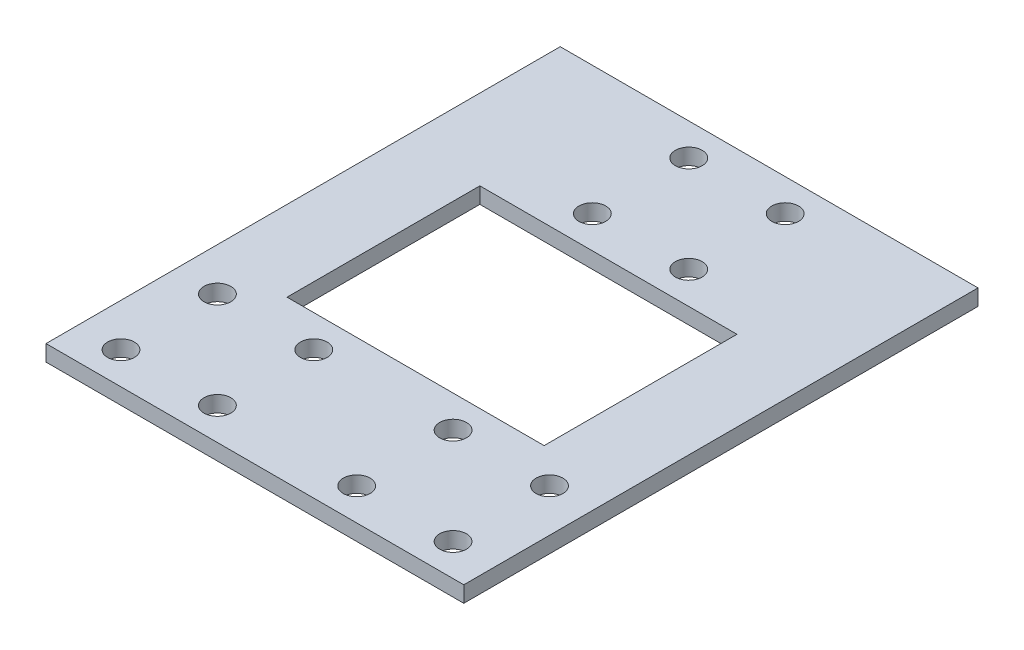
ISO-10303-21;
HEADER;
FILE_DESCRIPTION(('STEP AP214'),'2;1');
FILE_NAME('part.step','',(''),(''),'','','');
FILE_SCHEMA(('AUTOMOTIVE_DESIGN { 1 0 10303 214 1 1 1 1 }'));
ENDSEC;
DATA;
#1=APPLICATION_CONTEXT('core data for automotive mechanical design processes');
#2=APPLICATION_PROTOCOL_DEFINITION('international standard','automotive_design',2000,#1);
#3=PRODUCT_CONTEXT('',#1,'mechanical');
#4=PRODUCT('Part','Part','',(#3));
#5=PRODUCT_RELATED_PRODUCT_CATEGORY('part','',(#4));
#6=PRODUCT_DEFINITION_FORMATION('','',#4);
#7=PRODUCT_DEFINITION_CONTEXT('part definition',#1,'design');
#8=PRODUCT_DEFINITION('design','',#6,#7);
#9=PRODUCT_DEFINITION_SHAPE('','',#8);
#10=(LENGTH_UNIT() NAMED_UNIT(*) SI_UNIT(.MILLI.,.METRE.));
#11=(NAMED_UNIT(*) PLANE_ANGLE_UNIT() SI_UNIT($,.RADIAN.));
#12=(NAMED_UNIT(*) SI_UNIT($,.STERADIAN.) SOLID_ANGLE_UNIT());
#13=UNCERTAINTY_MEASURE_WITH_UNIT(LENGTH_MEASURE(1.E-05),#10,'distance_accuracy_value','');
#14=(GEOMETRIC_REPRESENTATION_CONTEXT(3) GLOBAL_UNCERTAINTY_ASSIGNED_CONTEXT((#13)) GLOBAL_UNIT_ASSIGNED_CONTEXT((#10,
#11,#12)) REPRESENTATION_CONTEXT('',''));
#15=CARTESIAN_POINT('',(0.,0.,0.));
#16=DIRECTION('',(0.,0.,1.));
#17=DIRECTION('',(1.,0.,0.));
#18=AXIS2_PLACEMENT_3D('',#15,#16,#17);
#19=CARTESIAN_POINT('',(0.,3.,0.));
#20=DIRECTION('',(1.,0.,0.));
#21=DIRECTION('',(0.,0.,-1.));
#22=AXIS2_PLACEMENT_3D('',#19,#20,#21);
#23=PLANE('',#22);
#24=DIRECTION('',(0.,0.,1.));
#25=VECTOR('',#24,1.);
#26=CARTESIAN_POINT('',(0.,0.,0.));
#27=LINE('',#26,#25);
#28=CARTESIAN_POINT('',(0.,0.,-96.));
#29=VERTEX_POINT('',#28);
#30=CARTESIAN_POINT('',(0.,0.,0.));
#31=VERTEX_POINT('',#30);
#32=EDGE_CURVE('E203',#29,#31,#27,.T.);
#33=ORIENTED_EDGE('',*,*,#32,.T.);
#34=DIRECTION('',(0.,-1.,0.));
#35=VECTOR('',#34,1.);
#36=CARTESIAN_POINT('',(0.,3.,0.));
#37=LINE('',#36,#35);
#38=CARTESIAN_POINT('',(0.,3.,0.));
#39=VERTEX_POINT('',#38);
#40=EDGE_CURVE('E11',#39,#31,#37,.T.);
#41=ORIENTED_EDGE('',*,*,#40,.F.);
#42=DIRECTION('',(0.,0.,1.));
#43=VECTOR('',#42,1.);
#44=CARTESIAN_POINT('',(0.,3.,0.));
#45=LINE('',#44,#43);
#46=CARTESIAN_POINT('',(0.,3.,-96.));
#47=VERTEX_POINT('',#46);
#48=EDGE_CURVE('E206',#47,#39,#45,.T.);
#49=ORIENTED_EDGE('',*,*,#48,.F.);
#50=DIRECTION('',(0.,-1.,0.));
#51=VECTOR('',#50,1.);
#52=CARTESIAN_POINT('',(0.,3.,-96.));
#53=LINE('',#52,#51);
#54=EDGE_CURVE('E216',#47,#29,#53,.T.);
#55=ORIENTED_EDGE('',*,*,#54,.T.);
#56=EDGE_LOOP('',(#33,#41,#49,#55));
#57=FACE_BOUND('',#56,.T.);
#58=ADVANCED_FACE('F33',(#57),#23,.F.);
#59=CARTESIAN_POINT('',(0.,3.,0.));
#60=DIRECTION('',(0.,0.,-1.));
#61=DIRECTION('',(-1.,0.,0.));
#62=AXIS2_PLACEMENT_3D('',#59,#60,#61);
#63=PLANE('',#62);
#64=DIRECTION('',(1.,0.,0.));
#65=VECTOR('',#64,1.);
#66=CARTESIAN_POINT('',(0.,0.,0.));
#67=LINE('',#66,#65);
#68=CARTESIAN_POINT('',(78.,0.,0.));
#69=VERTEX_POINT('',#68);
#70=EDGE_CURVE('E219',#31,#69,#67,.T.);
#71=ORIENTED_EDGE('',*,*,#70,.T.);
#72=DIRECTION('',(0.,-1.,0.));
#73=VECTOR('',#72,1.);
#74=CARTESIAN_POINT('',(78.,3.,0.));
#75=LINE('',#74,#73);
#76=CARTESIAN_POINT('',(78.,3.,0.));
#77=VERTEX_POINT('',#76);
#78=EDGE_CURVE('E40',#77,#69,#75,.T.);
#79=ORIENTED_EDGE('',*,*,#78,.F.);
#80=DIRECTION('',(1.,0.,0.));
#81=VECTOR('',#80,1.);
#82=CARTESIAN_POINT('',(0.,3.,0.));
#83=LINE('',#82,#81);
#84=EDGE_CURVE('E209',#39,#77,#83,.T.);
#85=ORIENTED_EDGE('',*,*,#84,.F.);
#86=ORIENTED_EDGE('',*,*,#40,.T.);
#87=EDGE_LOOP('',(#71,#79,#85,#86));
#88=FACE_BOUND('',#87,.T.);
#89=ADVANCED_FACE('F248',(#88),#63,.F.);
#90=CARTESIAN_POINT('',(78.,3.,0.));
#91=DIRECTION('',(-1.,0.,0.));
#92=DIRECTION('',(0.,0.,1.));
#93=AXIS2_PLACEMENT_3D('',#90,#91,#92);
#94=PLANE('',#93);
#95=DIRECTION('',(0.,0.,-1.));
#96=VECTOR('',#95,1.);
#97=CARTESIAN_POINT('',(78.,0.,0.));
#98=LINE('',#97,#96);
#99=CARTESIAN_POINT('',(78.,0.,-96.));
#100=VERTEX_POINT('',#99);
#101=EDGE_CURVE('E221',#69,#100,#98,.T.);
#102=ORIENTED_EDGE('',*,*,#101,.T.);
#103=DIRECTION('',(0.,-1.,0.));
#104=VECTOR('',#103,1.);
#105=CARTESIAN_POINT('',(78.,3.,-96.));
#106=LINE('',#105,#104);
#107=CARTESIAN_POINT('',(78.,3.,-96.));
#108=VERTEX_POINT('',#107);
#109=EDGE_CURVE('E226',#108,#100,#106,.T.);
#110=ORIENTED_EDGE('',*,*,#109,.F.);
#111=DIRECTION('',(0.,0.,-1.));
#112=VECTOR('',#111,1.);
#113=CARTESIAN_POINT('',(78.,3.,0.));
#114=LINE('',#113,#112);
#115=EDGE_CURVE('E212',#77,#108,#114,.T.);
#116=ORIENTED_EDGE('',*,*,#115,.F.);
#117=ORIENTED_EDGE('',*,*,#78,.T.);
#118=EDGE_LOOP('',(#102,#110,#116,#117));
#119=FACE_BOUND('',#118,.T.);
#120=ADVANCED_FACE('F233',(#119),#94,.F.);
#121=CARTESIAN_POINT('',(0.,3.,-96.));
#122=DIRECTION('',(0.,0.,1.));
#123=DIRECTION('',(1.,0.,0.));
#124=AXIS2_PLACEMENT_3D('',#121,#122,#123);
#125=PLANE('',#124);
#126=DIRECTION('',(-1.,0.,0.));
#127=VECTOR('',#126,1.);
#128=CARTESIAN_POINT('',(0.,0.,-96.));
#129=LINE('',#128,#127);
#130=EDGE_CURVE('E210',#100,#29,#129,.T.);
#131=ORIENTED_EDGE('',*,*,#130,.T.);
#132=ORIENTED_EDGE('',*,*,#54,.F.);
#133=DIRECTION('',(-1.,0.,0.));
#134=VECTOR('',#133,1.);
#135=CARTESIAN_POINT('',(0.,3.,-96.));
#136=LINE('',#135,#134);
#137=EDGE_CURVE('E214',#108,#47,#136,.T.);
#138=ORIENTED_EDGE('',*,*,#137,.F.);
#139=ORIENTED_EDGE('',*,*,#109,.T.);
#140=EDGE_LOOP('',(#131,#132,#138,#139));
#141=FACE_BOUND('',#140,.T.);
#142=ADVANCED_FACE('F241',(#141),#125,.F.);
#143=CARTESIAN_POINT('',(0.,3.,0.));
#144=DIRECTION('',(0.,-1.,0.));
#145=DIRECTION('',(0.,0.,-1.));
#146=AXIS2_PLACEMENT_3D('',#143,#144,#145);
#147=PLANE('',#146);
#148=DIRECTION('',(1.,0.,0.));
#149=VECTOR('',#148,1.);
#150=CARTESIAN_POINT('',(15.,3.,-30.));
#151=LINE('',#150,#149);
#152=CARTESIAN_POINT('',(15.,3.,-30.));
#153=VERTEX_POINT('',#152);
#154=CARTESIAN_POINT('',(63.,3.,-30.));
#155=VERTEX_POINT('',#154);
#156=EDGE_CURVE('E124',#153,#155,#151,.T.);
#157=ORIENTED_EDGE('',*,*,#156,.F.);
#158=DIRECTION('',(0.,0.,1.));
#159=VECTOR('',#158,1.);
#160=CARTESIAN_POINT('',(15.,3.,-66.0004589335234));
#161=LINE('',#160,#159);
#162=CARTESIAN_POINT('',(15.,3.,-66.0004589335234));
#163=VERTEX_POINT('',#162);
#164=EDGE_CURVE('E47',#163,#153,#161,.T.);
#165=ORIENTED_EDGE('',*,*,#164,.F.);
#166=DIRECTION('',(-1.,0.,0.));
#167=VECTOR('',#166,1.);
#168=CARTESIAN_POINT('',(15.,3.,-66.0004589335234));
#169=LINE('',#168,#167);
#170=CARTESIAN_POINT('',(63.,3.,-66.0004589335234));
#171=VERTEX_POINT('',#170);
#172=EDGE_CURVE('E115',#171,#163,#169,.T.);
#173=ORIENTED_EDGE('',*,*,#172,.F.);
#174=DIRECTION('',(0.,0.,-1.));
#175=VECTOR('',#174,1.);
#176=CARTESIAN_POINT('',(63.,3.,-66.0004589335234));
#177=LINE('',#176,#175);
#178=EDGE_CURVE('E118',#155,#171,#177,.T.);
#179=ORIENTED_EDGE('',*,*,#178,.F.);
#180=EDGE_LOOP('',(#157,#165,#173,#179));
#181=FACE_BOUND('',#180,.T.);
#182=CARTESIAN_POINT('',(30.0000000058494,3.,-90.000458888772));
#183=DIRECTION('',(0.,1.,0.));
#184=DIRECTION('',(0.,0.,1.));
#185=AXIS2_PLACEMENT_3D('',#182,#183,#184);
#186=CIRCLE('',#185,2.5);
#187=CARTESIAN_POINT('',(30.0000000058494,3.,-87.500458888772));
#188=VERTEX_POINT('',#187);
#189=EDGE_CURVE('E130',#188,#188,#186,.T.);
#190=ORIENTED_EDGE('',*,*,#189,.F.);
#191=EDGE_LOOP('',(#190));
#192=FACE_BOUND('',#191,.T.);
#193=CARTESIAN_POINT('',(48.,3.,-90.));
#194=DIRECTION('',(0.,1.,0.));
#195=DIRECTION('',(0.,0.,1.));
#196=AXIS2_PLACEMENT_3D('',#193,#194,#195);
#197=CIRCLE('',#196,2.5);
#198=CARTESIAN_POINT('',(48.,3.,-87.5));
#199=VERTEX_POINT('',#198);
#200=EDGE_CURVE('E137',#199,#199,#197,.T.);
#201=ORIENTED_EDGE('',*,*,#200,.F.);
#202=EDGE_LOOP('',(#201));
#203=FACE_BOUND('',#202,.T.);
#204=CARTESIAN_POINT('',(30.0012692785284,3.,-72.0004589335234));
#205=DIRECTION('',(0.,1.,0.));
#206=DIRECTION('',(0.,0.,1.));
#207=AXIS2_PLACEMENT_3D('',#204,#205,#206);
#208=CIRCLE('',#207,2.49999999999995);
#209=CARTESIAN_POINT('',(30.0012692785284,3.,-69.5004589335235));
#210=VERTEX_POINT('',#209);
#211=EDGE_CURVE('E143',#210,#210,#208,.T.);
#212=ORIENTED_EDGE('',*,*,#211,.F.);
#213=EDGE_LOOP('',(#212));
#214=FACE_BOUND('',#213,.T.);
#215=CARTESIAN_POINT('',(48.001269272679,3.,-72.0000000447515));
#216=DIRECTION('',(0.,1.,0.));
#217=DIRECTION('',(0.,0.,1.));
#218=AXIS2_PLACEMENT_3D('',#215,#216,#217);
#219=CIRCLE('',#218,2.5);
#220=CARTESIAN_POINT('',(48.001269272679,3.,-69.5000000447515));
#221=VERTEX_POINT('',#220);
#222=EDGE_CURVE('E149',#221,#221,#219,.T.);
#223=ORIENTED_EDGE('',*,*,#222,.F.);
#224=EDGE_LOOP('',(#223));
#225=FACE_BOUND('',#224,.T.);
#226=CARTESIAN_POINT('',(52.,3.,-24.));
#227=DIRECTION('',(0.,1.,0.));
#228=DIRECTION('',(0.,0.,1.));
#229=AXIS2_PLACEMENT_3D('',#226,#227,#228);
#230=CIRCLE('',#229,2.50000000000001);
#231=CARTESIAN_POINT('',(52.,3.,-21.5));
#232=VERTEX_POINT('',#231);
#233=EDGE_CURVE('E155',#232,#232,#230,.T.);
#234=ORIENTED_EDGE('',*,*,#233,.F.);
#235=EDGE_LOOP('',(#234));
#236=FACE_BOUND('',#235,.T.);
#237=CARTESIAN_POINT('',(70.,3.,-24.));
#238=DIRECTION('',(0.,1.,0.));
#239=DIRECTION('',(0.,0.,1.));
#240=AXIS2_PLACEMENT_3D('',#237,#238,#239);
#241=CIRCLE('',#240,2.5);
#242=CARTESIAN_POINT('',(70.,3.,-21.5));
#243=VERTEX_POINT('',#242);
#244=EDGE_CURVE('E161',#243,#243,#241,.T.);
#245=ORIENTED_EDGE('',*,*,#244,.F.);
#246=EDGE_LOOP('',(#245));
#247=FACE_BOUND('',#246,.T.);
#248=CARTESIAN_POINT('',(70.,3.,-6.00000000000001));
#249=DIRECTION('',(0.,1.,0.));
#250=DIRECTION('',(0.,0.,1.));
#251=AXIS2_PLACEMENT_3D('',#248,#249,#250);
#252=CIRCLE('',#251,2.49999999999999);
#253=CARTESIAN_POINT('',(70.,3.,-3.50000000000001));
#254=VERTEX_POINT('',#253);
#255=EDGE_CURVE('E167',#254,#254,#252,.T.);
#256=ORIENTED_EDGE('',*,*,#255,.F.);
#257=EDGE_LOOP('',(#256));
#258=FACE_BOUND('',#257,.T.);
#259=CARTESIAN_POINT('',(52.,3.,-6.00000000000001));
#260=DIRECTION('',(0.,1.,0.));
#261=DIRECTION('',(0.,0.,1.));
#262=AXIS2_PLACEMENT_3D('',#259,#260,#261);
#263=CIRCLE('',#262,2.49999999999999);
#264=CARTESIAN_POINT('',(52.,3.,-3.50000000000001));
#265=VERTEX_POINT('',#264);
#266=EDGE_CURVE('E173',#265,#265,#263,.T.);
#267=ORIENTED_EDGE('',*,*,#266,.F.);
#268=EDGE_LOOP('',(#267));
#269=FACE_BOUND('',#268,.T.);
#270=CARTESIAN_POINT('',(26.,3.,-24.));
#271=DIRECTION('',(0.,1.,0.));
#272=DIRECTION('',(0.,0.,1.));
#273=AXIS2_PLACEMENT_3D('',#270,#271,#272);
#274=CIRCLE('',#273,2.5);
#275=CARTESIAN_POINT('',(26.,3.,-21.5));
#276=VERTEX_POINT('',#275);
#277=EDGE_CURVE('E179',#276,#276,#274,.T.);
#278=ORIENTED_EDGE('',*,*,#277,.F.);
#279=EDGE_LOOP('',(#278));
#280=FACE_BOUND('',#279,.T.);
#281=CARTESIAN_POINT('',(8.,3.,-24.));
#282=DIRECTION('',(0.,1.,0.));
#283=DIRECTION('',(0.,0.,1.));
#284=AXIS2_PLACEMENT_3D('',#281,#282,#283);
#285=CIRCLE('',#284,2.5);
#286=CARTESIAN_POINT('',(8.,3.,-21.5));
#287=VERTEX_POINT('',#286);
#288=EDGE_CURVE('E185',#287,#287,#285,.T.);
#289=ORIENTED_EDGE('',*,*,#288,.F.);
#290=EDGE_LOOP('',(#289));
#291=FACE_BOUND('',#290,.T.);
#292=CARTESIAN_POINT('',(26.,3.,-6.00000000000001));
#293=DIRECTION('',(0.,1.,0.));
#294=DIRECTION('',(0.,0.,1.));
#295=AXIS2_PLACEMENT_3D('',#292,#293,#294);
#296=CIRCLE('',#295,2.5);
#297=CARTESIAN_POINT('',(26.,3.,-3.50000000000001));
#298=VERTEX_POINT('',#297);
#299=EDGE_CURVE('E191',#298,#298,#296,.T.);
#300=ORIENTED_EDGE('',*,*,#299,.F.);
#301=EDGE_LOOP('',(#300));
#302=FACE_BOUND('',#301,.T.);
#303=CARTESIAN_POINT('',(8.,3.,-6.00000000000001));
#304=DIRECTION('',(0.,1.,0.));
#305=DIRECTION('',(0.,0.,1.));
#306=AXIS2_PLACEMENT_3D('',#303,#304,#305);
#307=CIRCLE('',#306,2.5);
#308=CARTESIAN_POINT('',(8.,3.,-3.5));
#309=VERTEX_POINT('',#308);
#310=EDGE_CURVE('E197',#309,#309,#307,.T.);
#311=ORIENTED_EDGE('',*,*,#310,.F.);
#312=EDGE_LOOP('',(#311));
#313=FACE_BOUND('',#312,.T.);
#314=ORIENTED_EDGE('',*,*,#48,.T.);
#315=ORIENTED_EDGE('',*,*,#84,.T.);
#316=ORIENTED_EDGE('',*,*,#115,.T.);
#317=ORIENTED_EDGE('',*,*,#137,.T.);
#318=EDGE_LOOP('',(#314,#315,#316,#317));
#319=FACE_BOUND('',#318,.T.);
#320=ADVANCED_FACE('F247',(#181,#192,#203,#214,#225,#236,#247,#258,#269,#280,#291,#302,#313,
#319),#147,.F.);
#321=CARTESIAN_POINT('',(0.,0.,0.));
#322=DIRECTION('',(0.,-1.,0.));
#323=DIRECTION('',(0.,0.,-1.));
#324=AXIS2_PLACEMENT_3D('',#321,#322,#323);
#325=PLANE('',#324);
#326=DIRECTION('',(0.,0.,1.));
#327=VECTOR('',#326,1.);
#328=CARTESIAN_POINT('',(15.,0.,-66.0004589335234));
#329=LINE('',#328,#327);
#330=CARTESIAN_POINT('',(15.,0.,-66.0004589335234));
#331=VERTEX_POINT('',#330);
#332=CARTESIAN_POINT('',(15.,0.,-30.));
#333=VERTEX_POINT('',#332);
#334=EDGE_CURVE('E99',#331,#333,#329,.T.);
#335=ORIENTED_EDGE('',*,*,#334,.T.);
#336=DIRECTION('',(1.,0.,0.));
#337=VECTOR('',#336,1.);
#338=CARTESIAN_POINT('',(15.,0.,-30.));
#339=LINE('',#338,#337);
#340=CARTESIAN_POINT('',(63.,0.,-30.));
#341=VERTEX_POINT('',#340);
#342=EDGE_CURVE('E108',#333,#341,#339,.T.);
#343=ORIENTED_EDGE('',*,*,#342,.T.);
#344=DIRECTION('',(0.,0.,-1.));
#345=VECTOR('',#344,1.);
#346=CARTESIAN_POINT('',(63.,0.,-66.0004589335234));
#347=LINE('',#346,#345);
#348=CARTESIAN_POINT('',(63.,0.,-66.0004589335234));
#349=VERTEX_POINT('',#348);
#350=EDGE_CURVE('E55',#341,#349,#347,.T.);
#351=ORIENTED_EDGE('',*,*,#350,.T.);
#352=DIRECTION('',(-1.,0.,0.));
#353=VECTOR('',#352,1.);
#354=CARTESIAN_POINT('',(15.,0.,-66.0004589335234));
#355=LINE('',#354,#353);
#356=EDGE_CURVE('E105',#349,#331,#355,.T.);
#357=ORIENTED_EDGE('',*,*,#356,.T.);
#358=EDGE_LOOP('',(#335,#343,#351,#357));
#359=FACE_BOUND('',#358,.T.);
#360=CARTESIAN_POINT('',(30.0000000058494,0.,-90.000458888772));
#361=DIRECTION('',(0.,1.,0.));
#362=DIRECTION('',(0.,0.,1.));
#363=AXIS2_PLACEMENT_3D('',#360,#361,#362);
#364=CIRCLE('',#363,2.5);
#365=CARTESIAN_POINT('',(30.0000000058494,0.,-87.500458888772));
#366=VERTEX_POINT('',#365);
#367=EDGE_CURVE('E134',#366,#366,#364,.T.);
#368=ORIENTED_EDGE('',*,*,#367,.T.);
#369=EDGE_LOOP('',(#368));
#370=FACE_BOUND('',#369,.T.);
#371=CARTESIAN_POINT('',(48.,0.,-90.));
#372=DIRECTION('',(0.,1.,0.));
#373=DIRECTION('',(0.,0.,1.));
#374=AXIS2_PLACEMENT_3D('',#371,#372,#373);
#375=CIRCLE('',#374,2.5);
#376=CARTESIAN_POINT('',(48.,0.,-87.5));
#377=VERTEX_POINT('',#376);
#378=EDGE_CURVE('E140',#377,#377,#375,.T.);
#379=ORIENTED_EDGE('',*,*,#378,.T.);
#380=EDGE_LOOP('',(#379));
#381=FACE_BOUND('',#380,.T.);
#382=CARTESIAN_POINT('',(30.0012692785284,0.,-72.0004589335234));
#383=DIRECTION('',(0.,1.,0.));
#384=DIRECTION('',(0.,0.,1.));
#385=AXIS2_PLACEMENT_3D('',#382,#383,#384);
#386=CIRCLE('',#385,2.49999999999995);
#387=CARTESIAN_POINT('',(30.0012692785284,0.,-69.5004589335235));
#388=VERTEX_POINT('',#387);
#389=EDGE_CURVE('E146',#388,#388,#386,.T.);
#390=ORIENTED_EDGE('',*,*,#389,.T.);
#391=EDGE_LOOP('',(#390));
#392=FACE_BOUND('',#391,.T.);
#393=CARTESIAN_POINT('',(48.001269272679,0.,-72.0000000447515));
#394=DIRECTION('',(0.,1.,0.));
#395=DIRECTION('',(0.,0.,1.));
#396=AXIS2_PLACEMENT_3D('',#393,#394,#395);
#397=CIRCLE('',#396,2.5);
#398=CARTESIAN_POINT('',(48.001269272679,0.,-69.5000000447515));
#399=VERTEX_POINT('',#398);
#400=EDGE_CURVE('E152',#399,#399,#397,.T.);
#401=ORIENTED_EDGE('',*,*,#400,.T.);
#402=EDGE_LOOP('',(#401));
#403=FACE_BOUND('',#402,.T.);
#404=CARTESIAN_POINT('',(52.,0.,-24.));
#405=DIRECTION('',(0.,1.,0.));
#406=DIRECTION('',(0.,0.,1.));
#407=AXIS2_PLACEMENT_3D('',#404,#405,#406);
#408=CIRCLE('',#407,2.50000000000001);
#409=CARTESIAN_POINT('',(52.,0.,-21.5));
#410=VERTEX_POINT('',#409);
#411=EDGE_CURVE('E158',#410,#410,#408,.T.);
#412=ORIENTED_EDGE('',*,*,#411,.T.);
#413=EDGE_LOOP('',(#412));
#414=FACE_BOUND('',#413,.T.);
#415=CARTESIAN_POINT('',(70.,0.,-24.));
#416=DIRECTION('',(0.,1.,0.));
#417=DIRECTION('',(0.,0.,1.));
#418=AXIS2_PLACEMENT_3D('',#415,#416,#417);
#419=CIRCLE('',#418,2.5);
#420=CARTESIAN_POINT('',(70.,0.,-21.5));
#421=VERTEX_POINT('',#420);
#422=EDGE_CURVE('E164',#421,#421,#419,.T.);
#423=ORIENTED_EDGE('',*,*,#422,.T.);
#424=EDGE_LOOP('',(#423));
#425=FACE_BOUND('',#424,.T.);
#426=CARTESIAN_POINT('',(70.,0.,-6.00000000000001));
#427=DIRECTION('',(0.,1.,0.));
#428=DIRECTION('',(0.,0.,1.));
#429=AXIS2_PLACEMENT_3D('',#426,#427,#428);
#430=CIRCLE('',#429,2.49999999999999);
#431=CARTESIAN_POINT('',(70.,0.,-3.50000000000001));
#432=VERTEX_POINT('',#431);
#433=EDGE_CURVE('E170',#432,#432,#430,.T.);
#434=ORIENTED_EDGE('',*,*,#433,.T.);
#435=EDGE_LOOP('',(#434));
#436=FACE_BOUND('',#435,.T.);
#437=CARTESIAN_POINT('',(52.,0.,-6.00000000000001));
#438=DIRECTION('',(0.,1.,0.));
#439=DIRECTION('',(0.,0.,1.));
#440=AXIS2_PLACEMENT_3D('',#437,#438,#439);
#441=CIRCLE('',#440,2.49999999999999);
#442=CARTESIAN_POINT('',(52.,0.,-3.50000000000001));
#443=VERTEX_POINT('',#442);
#444=EDGE_CURVE('E176',#443,#443,#441,.T.);
#445=ORIENTED_EDGE('',*,*,#444,.T.);
#446=EDGE_LOOP('',(#445));
#447=FACE_BOUND('',#446,.T.);
#448=CARTESIAN_POINT('',(26.,0.,-24.));
#449=DIRECTION('',(0.,1.,0.));
#450=DIRECTION('',(0.,0.,1.));
#451=AXIS2_PLACEMENT_3D('',#448,#449,#450);
#452=CIRCLE('',#451,2.5);
#453=CARTESIAN_POINT('',(26.,0.,-21.5));
#454=VERTEX_POINT('',#453);
#455=EDGE_CURVE('E182',#454,#454,#452,.T.);
#456=ORIENTED_EDGE('',*,*,#455,.T.);
#457=EDGE_LOOP('',(#456));
#458=FACE_BOUND('',#457,.T.);
#459=CARTESIAN_POINT('',(8.,0.,-24.));
#460=DIRECTION('',(0.,1.,0.));
#461=DIRECTION('',(0.,0.,1.));
#462=AXIS2_PLACEMENT_3D('',#459,#460,#461);
#463=CIRCLE('',#462,2.5);
#464=CARTESIAN_POINT('',(8.,0.,-21.5));
#465=VERTEX_POINT('',#464);
#466=EDGE_CURVE('E188',#465,#465,#463,.T.);
#467=ORIENTED_EDGE('',*,*,#466,.T.);
#468=EDGE_LOOP('',(#467));
#469=FACE_BOUND('',#468,.T.);
#470=CARTESIAN_POINT('',(26.,0.,-6.00000000000001));
#471=DIRECTION('',(0.,1.,0.));
#472=DIRECTION('',(0.,0.,1.));
#473=AXIS2_PLACEMENT_3D('',#470,#471,#472);
#474=CIRCLE('',#473,2.5);
#475=CARTESIAN_POINT('',(26.,0.,-3.50000000000001));
#476=VERTEX_POINT('',#475);
#477=EDGE_CURVE('E194',#476,#476,#474,.T.);
#478=ORIENTED_EDGE('',*,*,#477,.T.);
#479=EDGE_LOOP('',(#478));
#480=FACE_BOUND('',#479,.T.);
#481=CARTESIAN_POINT('',(8.,0.,-6.00000000000001));
#482=DIRECTION('',(0.,1.,0.));
#483=DIRECTION('',(0.,0.,1.));
#484=AXIS2_PLACEMENT_3D('',#481,#482,#483);
#485=CIRCLE('',#484,2.5);
#486=CARTESIAN_POINT('',(8.,0.,-3.5));
#487=VERTEX_POINT('',#486);
#488=EDGE_CURVE('E200',#487,#487,#485,.T.);
#489=ORIENTED_EDGE('',*,*,#488,.T.);
#490=EDGE_LOOP('',(#489));
#491=FACE_BOUND('',#490,.T.);
#492=ORIENTED_EDGE('',*,*,#32,.F.);
#493=ORIENTED_EDGE('',*,*,#130,.F.);
#494=ORIENTED_EDGE('',*,*,#101,.F.);
#495=ORIENTED_EDGE('',*,*,#70,.F.);
#496=EDGE_LOOP('',(#492,#493,#494,#495));
#497=FACE_BOUND('',#496,.T.);
#498=ADVANCED_FACE('F112',(#359,#370,#381,#392,#403,#414,#425,#436,#447,#458,#469,#480,#491,
#497),#325,.T.);
#499=CARTESIAN_POINT('',(8.,0.,-6.00000000000001));
#500=DIRECTION('',(0.,1.,0.));
#501=DIRECTION('',(0.,0.,1.));
#502=AXIS2_PLACEMENT_3D('',#499,#500,#501);
#503=CYLINDRICAL_SURFACE('',#502,2.5);
#504=ORIENTED_EDGE('',*,*,#488,.F.);
#505=EDGE_LOOP('',(#504));
#506=FACE_BOUND('',#505,.T.);
#507=ORIENTED_EDGE('',*,*,#310,.T.);
#508=EDGE_LOOP('',(#507));
#509=FACE_BOUND('',#508,.T.);
#510=ADVANCED_FACE('F260',(#506,#509),#503,.F.);
#511=CARTESIAN_POINT('',(26.,0.,-6.00000000000001));
#512=DIRECTION('',(0.,1.,0.));
#513=DIRECTION('',(0.,0.,1.));
#514=AXIS2_PLACEMENT_3D('',#511,#512,#513);
#515=CYLINDRICAL_SURFACE('',#514,2.5);
#516=ORIENTED_EDGE('',*,*,#477,.F.);
#517=EDGE_LOOP('',(#516));
#518=FACE_BOUND('',#517,.T.);
#519=ORIENTED_EDGE('',*,*,#299,.T.);
#520=EDGE_LOOP('',(#519));
#521=FACE_BOUND('',#520,.T.);
#522=ADVANCED_FACE('F266',(#518,#521),#515,.F.);
#523=CARTESIAN_POINT('',(8.,0.,-24.));
#524=DIRECTION('',(0.,1.,0.));
#525=DIRECTION('',(0.,0.,1.));
#526=AXIS2_PLACEMENT_3D('',#523,#524,#525);
#527=CYLINDRICAL_SURFACE('',#526,2.5);
#528=ORIENTED_EDGE('',*,*,#466,.F.);
#529=EDGE_LOOP('',(#528));
#530=FACE_BOUND('',#529,.T.);
#531=ORIENTED_EDGE('',*,*,#288,.T.);
#532=EDGE_LOOP('',(#531));
#533=FACE_BOUND('',#532,.T.);
#534=ADVANCED_FACE('F270',(#530,#533),#527,.F.);
#535=CARTESIAN_POINT('',(26.,0.,-24.));
#536=DIRECTION('',(0.,1.,0.));
#537=DIRECTION('',(0.,0.,1.));
#538=AXIS2_PLACEMENT_3D('',#535,#536,#537);
#539=CYLINDRICAL_SURFACE('',#538,2.5);
#540=ORIENTED_EDGE('',*,*,#455,.F.);
#541=EDGE_LOOP('',(#540));
#542=FACE_BOUND('',#541,.T.);
#543=ORIENTED_EDGE('',*,*,#277,.T.);
#544=EDGE_LOOP('',(#543));
#545=FACE_BOUND('',#544,.T.);
#546=ADVANCED_FACE('F274',(#542,#545),#539,.F.);
#547=CARTESIAN_POINT('',(52.,0.,-6.00000000000001));
#548=DIRECTION('',(0.,1.,0.));
#549=DIRECTION('',(0.,0.,1.));
#550=AXIS2_PLACEMENT_3D('',#547,#548,#549);
#551=CYLINDRICAL_SURFACE('',#550,2.49999999999999);
#552=ORIENTED_EDGE('',*,*,#444,.F.);
#553=EDGE_LOOP('',(#552));
#554=FACE_BOUND('',#553,.T.);
#555=ORIENTED_EDGE('',*,*,#266,.T.);
#556=EDGE_LOOP('',(#555));
#557=FACE_BOUND('',#556,.T.);
#558=ADVANCED_FACE('F278',(#554,#557),#551,.F.);
#559=CARTESIAN_POINT('',(70.,0.,-6.00000000000001));
#560=DIRECTION('',(0.,1.,0.));
#561=DIRECTION('',(0.,0.,1.));
#562=AXIS2_PLACEMENT_3D('',#559,#560,#561);
#563=CYLINDRICAL_SURFACE('',#562,2.49999999999999);
#564=ORIENTED_EDGE('',*,*,#433,.F.);
#565=EDGE_LOOP('',(#564));
#566=FACE_BOUND('',#565,.T.);
#567=ORIENTED_EDGE('',*,*,#255,.T.);
#568=EDGE_LOOP('',(#567));
#569=FACE_BOUND('',#568,.T.);
#570=ADVANCED_FACE('F282',(#566,#569),#563,.F.);
#571=CARTESIAN_POINT('',(70.,0.,-24.));
#572=DIRECTION('',(0.,1.,0.));
#573=DIRECTION('',(0.,0.,1.));
#574=AXIS2_PLACEMENT_3D('',#571,#572,#573);
#575=CYLINDRICAL_SURFACE('',#574,2.5);
#576=ORIENTED_EDGE('',*,*,#422,.F.);
#577=EDGE_LOOP('',(#576));
#578=FACE_BOUND('',#577,.T.);
#579=ORIENTED_EDGE('',*,*,#244,.T.);
#580=EDGE_LOOP('',(#579));
#581=FACE_BOUND('',#580,.T.);
#582=ADVANCED_FACE('F286',(#578,#581),#575,.F.);
#583=CARTESIAN_POINT('',(52.,0.,-24.));
#584=DIRECTION('',(0.,1.,0.));
#585=DIRECTION('',(0.,0.,1.));
#586=AXIS2_PLACEMENT_3D('',#583,#584,#585);
#587=CYLINDRICAL_SURFACE('',#586,2.50000000000001);
#588=ORIENTED_EDGE('',*,*,#411,.F.);
#589=EDGE_LOOP('',(#588));
#590=FACE_BOUND('',#589,.T.);
#591=ORIENTED_EDGE('',*,*,#233,.T.);
#592=EDGE_LOOP('',(#591));
#593=FACE_BOUND('',#592,.T.);
#594=ADVANCED_FACE('F290',(#590,#593),#587,.F.);
#595=CARTESIAN_POINT('',(48.001269272679,0.,-72.0000000447515));
#596=DIRECTION('',(0.,1.,0.));
#597=DIRECTION('',(0.,0.,1.));
#598=AXIS2_PLACEMENT_3D('',#595,#596,#597);
#599=CYLINDRICAL_SURFACE('',#598,2.5);
#600=ORIENTED_EDGE('',*,*,#400,.F.);
#601=EDGE_LOOP('',(#600));
#602=FACE_BOUND('',#601,.T.);
#603=ORIENTED_EDGE('',*,*,#222,.T.);
#604=EDGE_LOOP('',(#603));
#605=FACE_BOUND('',#604,.T.);
#606=ADVANCED_FACE('F294',(#602,#605),#599,.F.);
#607=CARTESIAN_POINT('',(30.0012692785284,0.,-72.0004589335234));
#608=DIRECTION('',(0.,1.,0.));
#609=DIRECTION('',(0.,0.,1.));
#610=AXIS2_PLACEMENT_3D('',#607,#608,#609);
#611=CYLINDRICAL_SURFACE('',#610,2.49999999999995);
#612=ORIENTED_EDGE('',*,*,#389,.F.);
#613=EDGE_LOOP('',(#612));
#614=FACE_BOUND('',#613,.T.);
#615=ORIENTED_EDGE('',*,*,#211,.T.);
#616=EDGE_LOOP('',(#615));
#617=FACE_BOUND('',#616,.T.);
#618=ADVANCED_FACE('F298',(#614,#617),#611,.F.);
#619=CARTESIAN_POINT('',(48.,0.,-90.));
#620=DIRECTION('',(0.,1.,0.));
#621=DIRECTION('',(0.,0.,1.));
#622=AXIS2_PLACEMENT_3D('',#619,#620,#621);
#623=CYLINDRICAL_SURFACE('',#622,2.5);
#624=ORIENTED_EDGE('',*,*,#378,.F.);
#625=EDGE_LOOP('',(#624));
#626=FACE_BOUND('',#625,.T.);
#627=ORIENTED_EDGE('',*,*,#200,.T.);
#628=EDGE_LOOP('',(#627));
#629=FACE_BOUND('',#628,.T.);
#630=ADVANCED_FACE('F302',(#626,#629),#623,.F.);
#631=CARTESIAN_POINT('',(30.0000000058494,0.,-90.000458888772));
#632=DIRECTION('',(0.,1.,0.));
#633=DIRECTION('',(0.,0.,1.));
#634=AXIS2_PLACEMENT_3D('',#631,#632,#633);
#635=CYLINDRICAL_SURFACE('',#634,2.5);
#636=ORIENTED_EDGE('',*,*,#367,.F.);
#637=EDGE_LOOP('',(#636));
#638=FACE_BOUND('',#637,.T.);
#639=ORIENTED_EDGE('',*,*,#189,.T.);
#640=EDGE_LOOP('',(#639));
#641=FACE_BOUND('',#640,.T.);
#642=ADVANCED_FACE('F306',(#638,#641),#635,.F.);
#643=CARTESIAN_POINT('',(15.,0.,-66.0004589335234));
#644=DIRECTION('',(-1.,0.,0.));
#645=DIRECTION('',(0.,0.,1.));
#646=AXIS2_PLACEMENT_3D('',#643,#644,#645);
#647=PLANE('',#646);
#648=ORIENTED_EDGE('',*,*,#164,.T.);
#649=DIRECTION('',(0.,1.,0.));
#650=VECTOR('',#649,1.);
#651=CARTESIAN_POINT('',(15.,0.,-30.));
#652=LINE('',#651,#650);
#653=EDGE_CURVE('E95',#333,#153,#652,.T.);
#654=ORIENTED_EDGE('',*,*,#653,.F.);
#655=ORIENTED_EDGE('',*,*,#334,.F.);
#656=DIRECTION('',(0.,1.,0.));
#657=VECTOR('',#656,1.);
#658=CARTESIAN_POINT('',(15.,0.,-66.0004589335234));
#659=LINE('',#658,#657);
#660=EDGE_CURVE('E128',#331,#163,#659,.T.);
#661=ORIENTED_EDGE('',*,*,#660,.T.);
#662=EDGE_LOOP('',(#648,#654,#655,#661));
#663=FACE_BOUND('',#662,.T.);
#664=ADVANCED_FACE('F97',(#663),#647,.F.);
#665=CARTESIAN_POINT('',(15.,0.,-66.0004589335234));
#666=DIRECTION('',(0.,0.,-1.));
#667=DIRECTION('',(-1.,0.,0.));
#668=AXIS2_PLACEMENT_3D('',#665,#666,#667);
#669=PLANE('',#668);
#670=ORIENTED_EDGE('',*,*,#172,.T.);
#671=ORIENTED_EDGE('',*,*,#660,.F.);
#672=ORIENTED_EDGE('',*,*,#356,.F.);
#673=DIRECTION('',(0.,1.,0.));
#674=VECTOR('',#673,1.);
#675=CARTESIAN_POINT('',(63.,0.,-66.0004589335234));
#676=LINE('',#675,#674);
#677=EDGE_CURVE('E131',#349,#171,#676,.T.);
#678=ORIENTED_EDGE('',*,*,#677,.T.);
#679=EDGE_LOOP('',(#670,#671,#672,#678));
#680=FACE_BOUND('',#679,.T.);
#681=ADVANCED_FACE('F313',(#680),#669,.F.);
#682=CARTESIAN_POINT('',(63.,0.,-66.0004589335234));
#683=DIRECTION('',(1.,0.,0.));
#684=DIRECTION('',(0.,0.,-1.));
#685=AXIS2_PLACEMENT_3D('',#682,#683,#684);
#686=PLANE('',#685);
#687=ORIENTED_EDGE('',*,*,#178,.T.);
#688=ORIENTED_EDGE('',*,*,#677,.F.);
#689=ORIENTED_EDGE('',*,*,#350,.F.);
#690=DIRECTION('',(0.,1.,0.));
#691=VECTOR('',#690,1.);
#692=CARTESIAN_POINT('',(63.,0.,-30.));
#693=LINE('',#692,#691);
#694=EDGE_CURVE('E104',#341,#155,#693,.T.);
#695=ORIENTED_EDGE('',*,*,#694,.T.);
#696=EDGE_LOOP('',(#687,#688,#689,#695));
#697=FACE_BOUND('',#696,.T.);
#698=ADVANCED_FACE('F316',(#697),#686,.F.);
#699=CARTESIAN_POINT('',(15.,0.,-30.));
#700=DIRECTION('',(0.,0.,1.));
#701=DIRECTION('',(1.,0.,0.));
#702=AXIS2_PLACEMENT_3D('',#699,#700,#701);
#703=PLANE('',#702);
#704=ORIENTED_EDGE('',*,*,#156,.T.);
#705=ORIENTED_EDGE('',*,*,#694,.F.);
#706=ORIENTED_EDGE('',*,*,#342,.F.);
#707=ORIENTED_EDGE('',*,*,#653,.T.);
#708=EDGE_LOOP('',(#704,#705,#706,#707));
#709=FACE_BOUND('',#708,.T.);
#710=ADVANCED_FACE('F109',(#709),#703,.F.);
#711=CLOSED_SHELL('',(#58,#89,#120,#142,#320,#498,#510,#522,#534,#546,#558,#570,#582,#594,#606,
#618,#630,#642,#664,#681,#698,#710));
#712=MANIFOLD_SOLID_BREP('B2',#711);
#713=ADVANCED_BREP_SHAPE_REPRESENTATION('',(#18,#712),#14);
#714=SHAPE_DEFINITION_REPRESENTATION(#9,#713);
ENDSEC;
END-ISO-10303-21;
